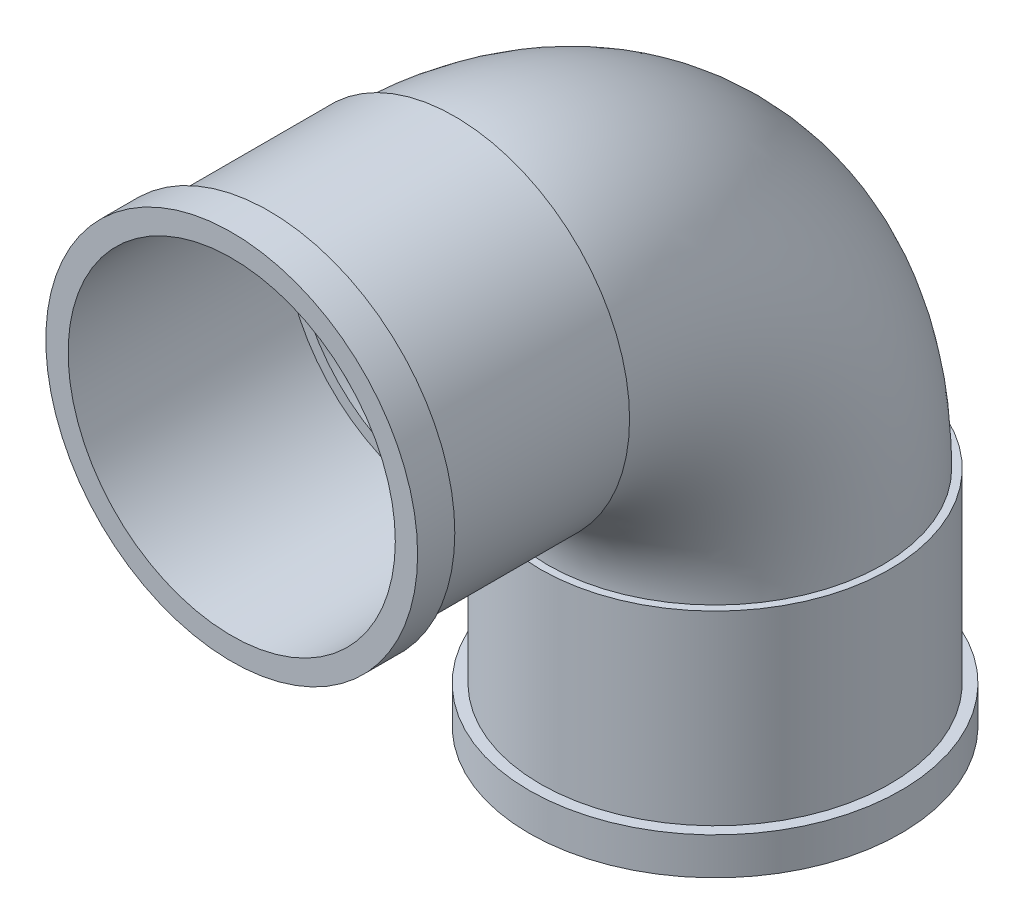
ISO-10303-21;
HEADER;
FILE_DESCRIPTION(('STEP AP214'),'2;1');
FILE_NAME('part.step','',(''),(''),'','','');
FILE_SCHEMA(('AUTOMOTIVE_DESIGN { 1 0 10303 214 1 1 1 1 }'));
ENDSEC;
DATA;
#1=APPLICATION_CONTEXT('core data for automotive mechanical design processes');
#2=APPLICATION_PROTOCOL_DEFINITION('international standard','automotive_design',2000,#1);
#3=PRODUCT_CONTEXT('',#1,'mechanical');
#4=PRODUCT('Part','Part','',(#3));
#5=PRODUCT_RELATED_PRODUCT_CATEGORY('part','',(#4));
#6=PRODUCT_DEFINITION_FORMATION('','',#4);
#7=PRODUCT_DEFINITION_CONTEXT('part definition',#1,'design');
#8=PRODUCT_DEFINITION('design','',#6,#7);
#9=PRODUCT_DEFINITION_SHAPE('','',#8);
#10=(LENGTH_UNIT() NAMED_UNIT(*) SI_UNIT(.MILLI.,.METRE.));
#11=(NAMED_UNIT(*) PLANE_ANGLE_UNIT() SI_UNIT($,.RADIAN.));
#12=(NAMED_UNIT(*) SI_UNIT($,.STERADIAN.) SOLID_ANGLE_UNIT());
#13=UNCERTAINTY_MEASURE_WITH_UNIT(LENGTH_MEASURE(1.E-05),#10,'distance_accuracy_value','');
#14=(GEOMETRIC_REPRESENTATION_CONTEXT(3) GLOBAL_UNCERTAINTY_ASSIGNED_CONTEXT((#13)) GLOBAL_UNIT_ASSIGNED_CONTEXT((#10,
#11,#12)) REPRESENTATION_CONTEXT('',''));
#15=CARTESIAN_POINT('',(0.,0.,0.));
#16=DIRECTION('',(0.,0.,1.));
#17=DIRECTION('',(1.,0.,0.));
#18=AXIS2_PLACEMENT_3D('',#15,#16,#17);
#19=CARTESIAN_POINT('',(0.,0.,-30.));
#20=DIRECTION('',(0.,0.,1.));
#21=DIRECTION('',(1.,0.,0.));
#22=AXIS2_PLACEMENT_3D('',#19,#20,#21);
#23=CYLINDRICAL_SURFACE('',#22,23.5);
#24=CARTESIAN_POINT('',(0.,0.,-30.));
#25=DIRECTION('',(0.,0.,1.));
#26=DIRECTION('',(1.,0.,0.));
#27=AXIS2_PLACEMENT_3D('',#24,#25,#26);
#28=CIRCLE('',#27,23.5);
#29=CARTESIAN_POINT('',(23.5,0.,-30.));
#30=VERTEX_POINT('',#29);
#31=EDGE_CURVE('E75',#30,#30,#28,.T.);
#32=ORIENTED_EDGE('',*,*,#31,.T.);
#33=EDGE_LOOP('',(#32));
#34=FACE_BOUND('',#33,.T.);
#35=CARTESIAN_POINT('',(0.,0.,-5.));
#36=DIRECTION('',(0.,0.,1.));
#37=DIRECTION('',(1.,0.,0.));
#38=AXIS2_PLACEMENT_3D('',#35,#36,#37);
#39=CIRCLE('',#38,23.5);
#40=CARTESIAN_POINT('',(23.5,0.,-5.));
#41=VERTEX_POINT('',#40);
#42=EDGE_CURVE('E104',#41,#41,#39,.T.);
#43=ORIENTED_EDGE('',*,*,#42,.F.);
#44=EDGE_LOOP('',(#43));
#45=FACE_BOUND('',#44,.T.);
#46=ADVANCED_FACE('F68',(#34,#45),#23,.T.);
#47=CARTESIAN_POINT('',(0.,0.,-30.));
#48=DIRECTION('',(0.,0.,1.));
#49=DIRECTION('',(1.,0.,0.));
#50=AXIS2_PLACEMENT_3D('',#47,#48,#49);
#51=CYLINDRICAL_SURFACE('',#50,20.5);
#52=CARTESIAN_POINT('',(0.,0.,-29.));
#53=DIRECTION('',(0.,0.,1.));
#54=DIRECTION('',(1.,0.,0.));
#55=AXIS2_PLACEMENT_3D('',#52,#53,#54);
#56=CIRCLE('',#55,20.5);
#57=CARTESIAN_POINT('',(20.5,0.,-29.));
#58=VERTEX_POINT('',#57);
#59=EDGE_CURVE('E85',#58,#58,#56,.T.);
#60=ORIENTED_EDGE('',*,*,#59,.T.);
#61=EDGE_LOOP('',(#60));
#62=FACE_BOUND('',#61,.T.);
#63=CARTESIAN_POINT('',(0.,0.,-30.));
#64=DIRECTION('',(0.,0.,1.));
#65=DIRECTION('',(0.,-1.,0.));
#66=AXIS2_PLACEMENT_3D('',#63,#64,#65);
#67=CIRCLE('',#66,20.5);
#68=CARTESIAN_POINT('',(0.,20.5,-30.));
#69=VERTEX_POINT('',#68);
#70=EDGE_CURVE('E100',#69,#69,#67,.T.);
#71=ORIENTED_EDGE('',*,*,#70,.F.);
#72=EDGE_LOOP('',(#71));
#73=FACE_BOUND('',#72,.T.);
#74=ADVANCED_FACE('F142',(#62,#73),#51,.F.);
#75=CARTESIAN_POINT('',(0.,0.,-30.));
#76=DIRECTION('',(0.,0.,1.));
#77=DIRECTION('',(1.,0.,0.));
#78=AXIS2_PLACEMENT_3D('',#75,#76,#77);
#79=PLANE('',#78);
#80=CARTESIAN_POINT('',(0.,0.,-30.));
#81=DIRECTION('',(0.,0.,1.));
#82=DIRECTION('',(1.,0.,0.));
#83=AXIS2_PLACEMENT_3D('',#80,#81,#82);
#84=CIRCLE('',#83,22.5);
#85=CARTESIAN_POINT('',(0.,22.5,-30.));
#86=VERTEX_POINT('',#85);
#87=EDGE_CURVE('E11',#86,#86,#84,.F.);
#88=ORIENTED_EDGE('',*,*,#87,.F.);
#89=EDGE_LOOP('',(#88));
#90=FACE_BOUND('',#89,.T.);
#91=ORIENTED_EDGE('',*,*,#31,.F.);
#92=EDGE_LOOP('',(#91));
#93=FACE_BOUND('',#92,.T.);
#94=ADVANCED_FACE('F147',(#90,#93),#79,.F.);
#95=CARTESIAN_POINT('',(0.,0.,0.));
#96=DIRECTION('',(0.,0.,1.));
#97=DIRECTION('',(1.,0.,0.));
#98=AXIS2_PLACEMENT_3D('',#95,#96,#97);
#99=PLANE('',#98);
#100=CARTESIAN_POINT('',(0.,0.,0.));
#101=DIRECTION('',(0.,0.,1.));
#102=DIRECTION('',(1.,0.,0.));
#103=AXIS2_PLACEMENT_3D('',#100,#101,#102);
#104=CIRCLE('',#103,22.);
#105=CARTESIAN_POINT('',(22.,0.,0.));
#106=VERTEX_POINT('',#105);
#107=EDGE_CURVE('E82',#106,#106,#104,.T.);
#108=ORIENTED_EDGE('',*,*,#107,.F.);
#109=EDGE_LOOP('',(#108));
#110=FACE_BOUND('',#109,.T.);
#111=CARTESIAN_POINT('',(0.,0.,0.));
#112=DIRECTION('',(0.,0.,1.));
#113=DIRECTION('',(1.,0.,0.));
#114=AXIS2_PLACEMENT_3D('',#111,#112,#113);
#115=CIRCLE('',#114,25.);
#116=CARTESIAN_POINT('',(25.,0.,0.));
#117=VERTEX_POINT('',#116);
#118=EDGE_CURVE('E114',#117,#117,#115,.T.);
#119=ORIENTED_EDGE('',*,*,#118,.T.);
#120=EDGE_LOOP('',(#119));
#121=FACE_BOUND('',#120,.T.);
#122=ADVANCED_FACE('F205',(#110,#121),#99,.T.);
#123=CARTESIAN_POINT('',(0.,0.,-29.));
#124=DIRECTION('',(0.,0.,1.));
#125=DIRECTION('',(1.,0.,0.));
#126=AXIS2_PLACEMENT_3D('',#123,#124,#125);
#127=CYLINDRICAL_SURFACE('',#126,22.);
#128=CARTESIAN_POINT('',(0.,0.,-29.));
#129=DIRECTION('',(0.,0.,1.));
#130=DIRECTION('',(1.,0.,0.));
#131=AXIS2_PLACEMENT_3D('',#128,#129,#130);
#132=CIRCLE('',#131,22.);
#133=CARTESIAN_POINT('',(22.,0.,-29.));
#134=VERTEX_POINT('',#133);
#135=EDGE_CURVE('E79',#134,#134,#132,.T.);
#136=CARTESIAN_POINT('',(22.,0.,-29.));
#137=CARTESIAN_POINT('',(22.,0.,-28.6979166666667));
#138=CARTESIAN_POINT('',(22.,0.,-28.3958333333333));
#139=CARTESIAN_POINT('',(22.,0.,-27.7916666666667));
#140=CARTESIAN_POINT('',(22.,0.,-27.4895833333333));
#141=CARTESIAN_POINT('',(22.,0.,-26.8854166666667));
#142=CARTESIAN_POINT('',(22.,0.,-26.5833333333333));
#143=CARTESIAN_POINT('',(22.,0.,-25.9791666666667));
#144=CARTESIAN_POINT('',(22.,0.,-25.6770833333333));
#145=CARTESIAN_POINT('',(22.,0.,-25.0729166666667));
#146=CARTESIAN_POINT('',(22.,0.,-24.7708333333333));
#147=CARTESIAN_POINT('',(22.,0.,-24.1666666666667));
#148=CARTESIAN_POINT('',(22.,0.,-23.8645833333333));
#149=CARTESIAN_POINT('',(22.,0.,-23.2604166666667));
#150=CARTESIAN_POINT('',(22.,0.,-22.9583333333333));
#151=CARTESIAN_POINT('',(22.,0.,-22.3541666666667));
#152=CARTESIAN_POINT('',(22.,0.,-22.0520833333333));
#153=CARTESIAN_POINT('',(22.,0.,-21.4479166666667));
#154=CARTESIAN_POINT('',(22.,0.,-21.1458333333333));
#155=CARTESIAN_POINT('',(22.,0.,-20.5416666666667));
#156=CARTESIAN_POINT('',(22.,0.,-20.2395833333333));
#157=CARTESIAN_POINT('',(22.,0.,-19.6354166666667));
#158=CARTESIAN_POINT('',(22.,0.,-19.3333333333333));
#159=CARTESIAN_POINT('',(22.,0.,-18.7291666666667));
#160=CARTESIAN_POINT('',(22.,0.,-18.4270833333333));
#161=CARTESIAN_POINT('',(22.,0.,-17.8229166666667));
#162=CARTESIAN_POINT('',(22.,0.,-17.5208333333333));
#163=CARTESIAN_POINT('',(22.,0.,-16.9166666666667));
#164=CARTESIAN_POINT('',(22.,0.,-16.6145833333333));
#165=CARTESIAN_POINT('',(22.,0.,-16.0104166666667));
#166=CARTESIAN_POINT('',(22.,0.,-15.7083333333333));
#167=CARTESIAN_POINT('',(22.,0.,-15.1041666666667));
#168=CARTESIAN_POINT('',(22.,0.,-14.8020833333333));
#169=CARTESIAN_POINT('',(22.,0.,-14.1979166666667));
#170=CARTESIAN_POINT('',(22.,0.,-13.8958333333333));
#171=CARTESIAN_POINT('',(22.,0.,-13.2916666666667));
#172=CARTESIAN_POINT('',(22.,0.,-12.9895833333333));
#173=CARTESIAN_POINT('',(22.,0.,-12.3854166666667));
#174=CARTESIAN_POINT('',(22.,0.,-12.0833333333333));
#175=CARTESIAN_POINT('',(22.,0.,-11.4791666666667));
#176=CARTESIAN_POINT('',(22.,0.,-11.1770833333333));
#177=CARTESIAN_POINT('',(22.,0.,-10.5729166666667));
#178=CARTESIAN_POINT('',(22.,0.,-10.2708333333333));
#179=CARTESIAN_POINT('',(22.,0.,-9.66666666666667));
#180=CARTESIAN_POINT('',(22.,0.,-9.36458333333333));
#181=CARTESIAN_POINT('',(22.,0.,-8.76041666666667));
#182=CARTESIAN_POINT('',(22.,0.,-8.45833333333334));
#183=CARTESIAN_POINT('',(22.,0.,-7.85416666666667));
#184=CARTESIAN_POINT('',(22.,0.,-7.55208333333334));
#185=CARTESIAN_POINT('',(22.,0.,-6.94791666666667));
#186=CARTESIAN_POINT('',(22.,0.,-6.64583333333334));
#187=CARTESIAN_POINT('',(22.,0.,-6.04166666666667));
#188=CARTESIAN_POINT('',(22.,0.,-5.73958333333333));
#189=CARTESIAN_POINT('',(22.,0.,-5.13541666666667));
#190=CARTESIAN_POINT('',(22.,0.,-4.83333333333333));
#191=CARTESIAN_POINT('',(22.,0.,-4.22916666666667));
#192=CARTESIAN_POINT('',(22.,0.,-3.92708333333333));
#193=CARTESIAN_POINT('',(22.,0.,-3.32291666666667));
#194=CARTESIAN_POINT('',(22.,0.,-3.02083333333333));
#195=CARTESIAN_POINT('',(22.,0.,-2.41666666666667));
#196=CARTESIAN_POINT('',(22.,0.,-2.11458333333334));
#197=CARTESIAN_POINT('',(22.,0.,-1.51041666666667));
#198=CARTESIAN_POINT('',(22.,0.,-1.20833333333333));
#199=CARTESIAN_POINT('',(22.,0.,-0.604166666666667));
#200=CARTESIAN_POINT('',(22.,0.,-0.302083333333333));
#201=CARTESIAN_POINT('',(22.,0.,0.));
#202=B_SPLINE_CURVE_WITH_KNOTS('',3,(#136,#137,#138,#139,#140,#141,#142,#143,#144,#145,#146,
#147,#148,#149,#150,#151,#152,#153,#154,#155,#156,#157,#158,#159,#160,#161,#162,#163,#164,#165,
#166,#167,#168,#169,#170,#171,#172,#173,#174,#175,#176,#177,#178,#179,#180,#181,#182,#183,#184,
#185,#186,#187,#188,#189,#190,#191,#192,#193,#194,#195,#196,#197,#198,#199,#200,#201),
.UNSPECIFIED.,.F.,.F.,(4,2,2,2,2,2,2,2,2,2,2,2,2,2,2,2,2,2,2,2,2,2,2,2,2,2,2,2,2,2,2,2,4),(0.,
0.906250000000001,1.8125,2.71875,3.625,4.53125,5.4375,6.34375,7.25,8.15625,9.0625,
9.96875000000001,10.875,11.78125,12.6875,13.59375,14.5,15.40625,16.3125,17.21875,18.125,
19.03125,19.9375,20.84375,21.75,22.65625,23.5625,24.46875,25.375,26.28125,27.1875,28.09375,29.),.UNSPECIFIED.);
#203=EDGE_CURVE('BSEAM201',#134,#106,#202,.T.);
#204=ORIENTED_EDGE('',*,*,#135,.F.);
#205=ORIENTED_EDGE('',*,*,#107,.T.);
#206=ORIENTED_EDGE('',*,*,#203,.T.);
#207=ORIENTED_EDGE('',*,*,#203,.F.);
#208=EDGE_LOOP('',(#204,#206,#205,#207));
#209=FACE_BOUND('',#208,.T.);
#210=ADVANCED_FACE('F201',(#209),#127,.F.);
#211=CARTESIAN_POINT('',(0.,0.,-29.));
#212=DIRECTION('',(0.,0.,1.));
#213=DIRECTION('',(1.,0.,0.));
#214=AXIS2_PLACEMENT_3D('',#211,#212,#213);
#215=PLANE('',#214);
#216=ORIENTED_EDGE('',*,*,#59,.F.);
#217=EDGE_LOOP('',(#216));
#218=FACE_BOUND('',#217,.T.);
#219=ORIENTED_EDGE('',*,*,#135,.T.);
#220=EDGE_LOOP('',(#219));
#221=FACE_BOUND('',#220,.T.);
#222=ADVANCED_FACE('F196',(#218,#221),#215,.T.);
#223=CARTESIAN_POINT('',(0.,-35.,-30.));
#224=DIRECTION('',(-1.,0.,0.));
#225=DIRECTION('',(0.,0.,1.));
#226=AXIS2_PLACEMENT_3D('',#223,#224,#225);
#227=TOROIDAL_SURFACE('',#226,35.,22.5);
#228=CARTESIAN_POINT('',(0.,-35.,-65.));
#229=DIRECTION('',(0.,1.,0.));
#230=DIRECTION('',(0.,0.,1.));
#231=AXIS2_PLACEMENT_3D('',#228,#229,#230);
#232=CIRCLE('',#231,22.5);
#233=CARTESIAN_POINT('',(0.,-35.,-87.5));
#234=VERTEX_POINT('',#233);
#235=EDGE_CURVE('E86',#234,#234,#232,.T.);
#236=CARTESIAN_POINT('',(0.,-35.,-30.));
#237=DIRECTION('',(-1.,0.,0.));
#238=DIRECTION('',(0.,0.,1.));
#239=AXIS2_PLACEMENT_3D('',#236,#237,#238);
#240=CIRCLE('',#239,57.5);
#241=EDGE_CURVE('',#86,#234,#240,.T.);
#242=ORIENTED_EDGE('',*,*,#87,.T.);
#243=ORIENTED_EDGE('',*,*,#235,.T.);
#244=ORIENTED_EDGE('',*,*,#241,.T.);
#245=ORIENTED_EDGE('',*,*,#241,.F.);
#246=EDGE_LOOP('',(#242,#244,#243,#245));
#247=FACE_BOUND('',#246,.T.);
#248=ADVANCED_FACE('F185',(#247),#227,.T.);
#249=CARTESIAN_POINT('',(0.,-36.,-65.));
#250=DIRECTION('',(0.,-1.,0.));
#251=DIRECTION('',(0.,0.,-1.));
#252=AXIS2_PLACEMENT_3D('',#249,#250,#251);
#253=CYLINDRICAL_SURFACE('',#252,22.);
#254=CARTESIAN_POINT('',(0.,-65.,-65.));
#255=DIRECTION('',(0.,1.,0.));
#256=DIRECTION('',(0.,0.,1.));
#257=AXIS2_PLACEMENT_3D('',#254,#255,#256);
#258=CIRCLE('',#257,22.);
#259=CARTESIAN_POINT('',(0.,-65.,-87.));
#260=VERTEX_POINT('',#259);
#261=EDGE_CURVE('E96',#260,#260,#258,.T.);
#262=CARTESIAN_POINT('',(0.,-36.3626942738953,-65.));
#263=DIRECTION('',(0.,1.,0.));
#264=DIRECTION('',(0.,0.,1.));
#265=AXIS2_PLACEMENT_3D('',#262,#263,#264);
#266=CIRCLE('',#265,22.);
#267=CARTESIAN_POINT('',(0.,-36.3626942738953,-87.));
#268=VERTEX_POINT('',#267);
#269=EDGE_CURVE('E71',#268,#268,#266,.F.);
#270=CARTESIAN_POINT('',(0.,-65.,-87.));
#271=CARTESIAN_POINT('',(0.,-64.7016947320198,-87.));
#272=CARTESIAN_POINT('',(0.,-64.4033894640395,-87.));
#273=CARTESIAN_POINT('',(0.,-63.806778928079,-87.));
#274=CARTESIAN_POINT('',(0.,-63.5084736600987,-87.));
#275=CARTESIAN_POINT('',(0.,-62.9118631241382,-87.));
#276=CARTESIAN_POINT('',(0.,-62.613557856158,-87.));
#277=CARTESIAN_POINT('',(0.,-62.0169473201974,-87.));
#278=CARTESIAN_POINT('',(0.,-61.7186420522172,-87.));
#279=CARTESIAN_POINT('',(0.,-61.1220315162567,-87.));
#280=CARTESIAN_POINT('',(0.,-60.8237262482764,-87.));
#281=CARTESIAN_POINT('',(0.,-60.2271157123159,-87.));
#282=CARTESIAN_POINT('',(0.,-59.9288104443356,-87.));
#283=CARTESIAN_POINT('',(0.,-59.3321999083751,-87.));
#284=CARTESIAN_POINT('',(0.,-59.0338946403949,-87.));
#285=CARTESIAN_POINT('',(0.,-58.4372841044344,-87.));
#286=CARTESIAN_POINT('',(0.,-58.1389788364541,-87.));
#287=CARTESIAN_POINT('',(0.,-57.5423683004936,-87.));
#288=CARTESIAN_POINT('',(0.,-57.2440630325133,-87.));
#289=CARTESIAN_POINT('',(0.,-56.6474524965528,-87.));
#290=CARTESIAN_POINT('',(0.,-56.3491472285726,-87.));
#291=CARTESIAN_POINT('',(0.,-55.752536692612,-87.));
#292=CARTESIAN_POINT('',(0.,-55.4542314246318,-87.));
#293=CARTESIAN_POINT('',(0.,-54.8576208886713,-87.));
#294=CARTESIAN_POINT('',(0.,-54.559315620691,-87.));
#295=CARTESIAN_POINT('',(0.,-53.9627050847305,-87.));
#296=CARTESIAN_POINT('',(0.,-53.6643998167502,-87.));
#297=CARTESIAN_POINT('',(0.,-53.0677892807897,-87.));
#298=CARTESIAN_POINT('',(0.,-52.7694840128095,-87.));
#299=CARTESIAN_POINT('',(0.,-52.1728734768489,-87.));
#300=CARTESIAN_POINT('',(0.,-51.8745682088687,-87.));
#301=CARTESIAN_POINT('',(0.,-51.2779576729082,-87.));
#302=CARTESIAN_POINT('',(0.,-50.9796524049279,-87.));
#303=CARTESIAN_POINT('',(0.,-50.3830418689674,-87.));
#304=CARTESIAN_POINT('',(0.,-50.0847366009872,-87.));
#305=CARTESIAN_POINT('',(0.,-49.4881260650266,-87.));
#306=CARTESIAN_POINT('',(0.,-49.1898207970464,-87.));
#307=CARTESIAN_POINT('',(0.,-48.5932102610859,-87.));
#308=CARTESIAN_POINT('',(0.,-48.2949049931056,-87.));
#309=CARTESIAN_POINT('',(0.,-47.6982944571451,-87.));
#310=CARTESIAN_POINT('',(0.,-47.3999891891648,-87.));
#311=CARTESIAN_POINT('',(0.,-46.8033786532043,-87.));
#312=CARTESIAN_POINT('',(0.,-46.5050733852241,-87.));
#313=CARTESIAN_POINT('',(0.,-45.9084628492636,-87.));
#314=CARTESIAN_POINT('',(0.,-45.6101575812833,-87.));
#315=CARTESIAN_POINT('',(0.,-45.0135470453228,-87.));
#316=CARTESIAN_POINT('',(0.,-44.7152417773425,-87.));
#317=CARTESIAN_POINT('',(0.,-44.118631241382,-87.));
#318=CARTESIAN_POINT('',(0.,-43.8203259734018,-87.));
#319=CARTESIAN_POINT('',(0.,-43.2237154374412,-87.));
#320=CARTESIAN_POINT('',(0.,-42.925410169461,-87.));
#321=CARTESIAN_POINT('',(0.,-42.3287996335005,-87.));
#322=CARTESIAN_POINT('',(0.,-42.0304943655202,-87.));
#323=CARTESIAN_POINT('',(0.,-41.4338838295597,-87.));
#324=CARTESIAN_POINT('',(0.,-41.1355785615794,-87.));
#325=CARTESIAN_POINT('',(0.,-40.5389680256189,-87.));
#326=CARTESIAN_POINT('',(0.,-40.2406627576387,-87.));
#327=CARTESIAN_POINT('',(0.,-39.6440522216782,-87.));
#328=CARTESIAN_POINT('',(0.,-39.3457469536979,-87.));
#329=CARTESIAN_POINT('',(0.,-38.7491364177374,-87.));
#330=CARTESIAN_POINT('',(0.,-38.4508311497571,-87.));
#331=CARTESIAN_POINT('',(0.,-37.8542206137966,-87.));
#332=CARTESIAN_POINT('',(0.,-37.5559153458164,-87.));
#333=CARTESIAN_POINT('',(0.,-36.9593048098558,-87.));
#334=CARTESIAN_POINT('',(0.,-36.6609995418756,-87.));
#335=CARTESIAN_POINT('',(0.,-36.3626942738953,-87.));
#336=B_SPLINE_CURVE_WITH_KNOTS('',3,(#270,#271,#272,#273,#274,#275,#276,#277,#278,#279,#280,
#281,#282,#283,#284,#285,#286,#287,#288,#289,#290,#291,#292,#293,#294,#295,#296,#297,#298,#299,
#300,#301,#302,#303,#304,#305,#306,#307,#308,#309,#310,#311,#312,#313,#314,#315,#316,#317,#318,
#319,#320,#321,#322,#323,#324,#325,#326,#327,#328,#329,#330,#331,#332,#333,#334,#335),
.UNSPECIFIED.,.F.,.F.,(4,2,2,2,2,2,2,2,2,2,2,2,2,2,2,2,2,2,2,2,2,2,2,2,2,2,2,2,2,2,2,2,4),(0.,
0.894915803940771,1.78983160788154,2.68474741182231,3.57966321576308,4.47457901970386,
5.36949482364463,6.26441062758541,7.15932643152618,8.05424223546695,8.94915803940772,
9.84407384334849,10.7389896472893,11.63390545123,12.5288212551708,13.4237370591116,
14.3186528630523,15.2135686669931,16.1084844709339,17.0034002748747,17.8983160788154,
18.7932318827562,19.688147686697,20.5830634906377,21.4779792945785,22.3728950985193,
23.2678109024601,24.1627267064008,25.0576425103416,25.9525583142824,26.8474741182232,
27.7423899221639,28.6373057261047),.UNSPECIFIED.);
#337=EDGE_CURVE('BSEAM181',#260,#268,#336,.T.);
#338=ORIENTED_EDGE('',*,*,#261,.F.);
#339=ORIENTED_EDGE('',*,*,#269,.F.);
#340=ORIENTED_EDGE('',*,*,#337,.T.);
#341=ORIENTED_EDGE('',*,*,#337,.F.);
#342=EDGE_LOOP('',(#338,#340,#339,#341));
#343=FACE_BOUND('',#342,.T.);
#344=ADVANCED_FACE('F181',(#343),#253,.F.);
#345=CARTESIAN_POINT('',(0.,-65.,0.));
#346=DIRECTION('',(0.,1.,0.));
#347=DIRECTION('',(0.,0.,1.));
#348=AXIS2_PLACEMENT_3D('',#345,#346,#347);
#349=PLANE('',#348);
#350=ORIENTED_EDGE('',*,*,#261,.T.);
#351=EDGE_LOOP('',(#350));
#352=FACE_BOUND('',#351,.T.);
#353=CARTESIAN_POINT('',(0.,-65.,-65.));
#354=DIRECTION('',(0.,1.,0.));
#355=DIRECTION('',(0.,0.,1.));
#356=AXIS2_PLACEMENT_3D('',#353,#354,#355);
#357=CIRCLE('',#356,25.);
#358=CARTESIAN_POINT('',(0.,-65.,-40.));
#359=VERTEX_POINT('',#358);
#360=EDGE_CURVE('E117',#359,#359,#357,.T.);
#361=ORIENTED_EDGE('',*,*,#360,.F.);
#362=EDGE_LOOP('',(#361));
#363=FACE_BOUND('',#362,.T.);
#364=ADVANCED_FACE('F184',(#352,#363),#349,.F.);
#365=CARTESIAN_POINT('',(0.,-35.,-65.));
#366=DIRECTION('',(0.,-1.,0.));
#367=DIRECTION('',(0.,0.,-1.));
#368=AXIS2_PLACEMENT_3D('',#365,#366,#367);
#369=CYLINDRICAL_SURFACE('',#368,23.5);
#370=CARTESIAN_POINT('',(0.,-60.,-65.));
#371=DIRECTION('',(0.,1.,0.));
#372=DIRECTION('',(0.,0.,1.));
#373=AXIS2_PLACEMENT_3D('',#370,#371,#372);
#374=CIRCLE('',#373,23.5);
#375=CARTESIAN_POINT('',(0.,-60.,-41.5));
#376=VERTEX_POINT('',#375);
#377=EDGE_CURVE('E123',#376,#376,#374,.T.);
#378=ORIENTED_EDGE('',*,*,#377,.T.);
#379=EDGE_LOOP('',(#378));
#380=FACE_BOUND('',#379,.T.);
#381=CARTESIAN_POINT('',(0.,-35.,-65.));
#382=DIRECTION('',(0.,1.,0.));
#383=DIRECTION('',(0.,0.,1.));
#384=AXIS2_PLACEMENT_3D('',#381,#382,#383);
#385=CIRCLE('',#384,23.5);
#386=CARTESIAN_POINT('',(0.,-35.,-41.5));
#387=VERTEX_POINT('',#386);
#388=EDGE_CURVE('E93',#387,#387,#385,.T.);
#389=ORIENTED_EDGE('',*,*,#388,.F.);
#390=EDGE_LOOP('',(#389));
#391=FACE_BOUND('',#390,.T.);
#392=ADVANCED_FACE('F127',(#380,#391),#369,.T.);
#393=CARTESIAN_POINT('',(0.,-35.,0.));
#394=DIRECTION('',(0.,1.,0.));
#395=DIRECTION('',(0.,0.,1.));
#396=AXIS2_PLACEMENT_3D('',#393,#394,#395);
#397=PLANE('',#396);
#398=ORIENTED_EDGE('',*,*,#235,.F.);
#399=EDGE_LOOP('',(#398));
#400=FACE_BOUND('',#399,.T.);
#401=ORIENTED_EDGE('',*,*,#388,.T.);
#402=EDGE_LOOP('',(#401));
#403=FACE_BOUND('',#402,.T.);
#404=ADVANCED_FACE('F175',(#400,#403),#397,.T.);
#405=CARTESIAN_POINT('',(0.,-36.3626942738953,-65.));
#406=DIRECTION('',(0.,1.,0.));
#407=DIRECTION('',(0.,0.,1.));
#408=AXIS2_PLACEMENT_3D('',#405,#406,#407);
#409=PLANE('',#408);
#410=CARTESIAN_POINT('',(0.,-36.3626942738953,-64.9999999999989));
#411=DIRECTION('',(0.,1.,0.));
#412=DIRECTION('',(0.,0.,1.));
#413=AXIS2_PLACEMENT_3D('',#410,#411,#412);
#414=CIRCLE('',#413,20.5);
#415=CARTESIAN_POINT('',(0.,-36.3626942738953,-44.4999999999989));
#416=VERTEX_POINT('',#415);
#417=EDGE_CURVE('E99',#416,#416,#414,.T.);
#418=ORIENTED_EDGE('',*,*,#417,.T.);
#419=EDGE_LOOP('',(#418));
#420=FACE_BOUND('',#419,.T.);
#421=ORIENTED_EDGE('',*,*,#269,.T.);
#422=EDGE_LOOP('',(#421));
#423=FACE_BOUND('',#422,.T.);
#424=ADVANCED_FACE('F167',(#420,#423),#409,.F.);
#425=CARTESIAN_POINT('',(0.,-35.,-30.));
#426=DIRECTION('',(-1.,0.,0.));
#427=DIRECTION('',(0.,0.,1.));
#428=AXIS2_PLACEMENT_3D('',#425,#426,#427);
#429=TOROIDAL_SURFACE('',#428,35.,20.5);
#430=CARTESIAN_POINT('',(0.,-35.000000000002,-64.9999999999989));
#431=DIRECTION('',(0.,1.,0.));
#432=DIRECTION('',(0.,0.,1.));
#433=AXIS2_PLACEMENT_3D('',#430,#431,#432);
#434=CIRCLE('',#433,20.5);
#435=CARTESIAN_POINT('',(0.,-35.0000000000032,-85.5));
#436=VERTEX_POINT('',#435);
#437=EDGE_CURVE('E103',#436,#436,#434,.T.);
#438=CARTESIAN_POINT('',(0.,-35.,-30.));
#439=DIRECTION('',(-1.,0.,0.));
#440=DIRECTION('',(0.,0.,1.));
#441=AXIS2_PLACEMENT_3D('',#438,#439,#440);
#442=CIRCLE('',#441,55.5);
#443=EDGE_CURVE('',#69,#436,#442,.T.);
#444=ORIENTED_EDGE('',*,*,#70,.T.);
#445=ORIENTED_EDGE('',*,*,#437,.F.);
#446=ORIENTED_EDGE('',*,*,#443,.T.);
#447=ORIENTED_EDGE('',*,*,#443,.F.);
#448=EDGE_LOOP('',(#444,#446,#445,#447));
#449=FACE_BOUND('',#448,.T.);
#450=ADVANCED_FACE('F158',(#449),#429,.F.);
#451=CARTESIAN_POINT('',(0.,-35.000000000002,-64.9999999999989));
#452=DIRECTION('',(0.,-1.,0.));
#453=DIRECTION('',(0.,0.,-1.));
#454=AXIS2_PLACEMENT_3D('',#451,#452,#453);
#455=CYLINDRICAL_SURFACE('',#454,20.5);
#456=ORIENTED_EDGE('',*,*,#417,.F.);
#457=EDGE_LOOP('',(#456));
#458=FACE_BOUND('',#457,.T.);
#459=ORIENTED_EDGE('',*,*,#437,.T.);
#460=EDGE_LOOP('',(#459));
#461=FACE_BOUND('',#460,.T.);
#462=ADVANCED_FACE('F155',(#458,#461),#455,.F.);
#463=CARTESIAN_POINT('',(0.,0.,-5.));
#464=DIRECTION('',(0.,0.,1.));
#465=DIRECTION('',(1.,0.,0.));
#466=AXIS2_PLACEMENT_3D('',#463,#464,#465);
#467=PLANE('',#466);
#468=CARTESIAN_POINT('',(0.,0.,-5.));
#469=DIRECTION('',(0.,0.,1.));
#470=DIRECTION('',(1.,0.,0.));
#471=AXIS2_PLACEMENT_3D('',#468,#469,#470);
#472=CIRCLE('',#471,25.);
#473=CARTESIAN_POINT('',(25.,0.,-5.));
#474=VERTEX_POINT('',#473);
#475=EDGE_CURVE('E111',#474,#474,#472,.T.);
#476=ORIENTED_EDGE('',*,*,#475,.F.);
#477=EDGE_LOOP('',(#476));
#478=FACE_BOUND('',#477,.T.);
#479=ORIENTED_EDGE('',*,*,#42,.T.);
#480=EDGE_LOOP('',(#479));
#481=FACE_BOUND('',#480,.T.);
#482=ADVANCED_FACE('F153',(#478,#481),#467,.F.);
#483=CARTESIAN_POINT('',(0.,0.,0.));
#484=DIRECTION('',(0.,0.,1.));
#485=DIRECTION('',(1.,0.,0.));
#486=AXIS2_PLACEMENT_3D('',#483,#484,#485);
#487=CYLINDRICAL_SURFACE('',#486,25.);
#488=ORIENTED_EDGE('',*,*,#475,.T.);
#489=EDGE_LOOP('',(#488));
#490=FACE_BOUND('',#489,.T.);
#491=ORIENTED_EDGE('',*,*,#118,.F.);
#492=EDGE_LOOP('',(#491));
#493=FACE_BOUND('',#492,.T.);
#494=ADVANCED_FACE('F138',(#490,#493),#487,.T.);
#495=CARTESIAN_POINT('',(0.,0.,-65.));
#496=DIRECTION('',(0.,1.,0.));
#497=DIRECTION('',(0.,0.,1.));
#498=AXIS2_PLACEMENT_3D('',#495,#496,#497);
#499=CYLINDRICAL_SURFACE('',#498,25.);
#500=CARTESIAN_POINT('',(0.,-60.,-65.));
#501=DIRECTION('',(0.,1.,0.));
#502=DIRECTION('',(0.,0.,1.));
#503=AXIS2_PLACEMENT_3D('',#500,#501,#502);
#504=CIRCLE('',#503,25.);
#505=CARTESIAN_POINT('',(0.,-60.,-40.));
#506=VERTEX_POINT('',#505);
#507=EDGE_CURVE('E120',#506,#506,#504,.T.);
#508=ORIENTED_EDGE('',*,*,#507,.F.);
#509=EDGE_LOOP('',(#508));
#510=FACE_BOUND('',#509,.T.);
#511=ORIENTED_EDGE('',*,*,#360,.T.);
#512=EDGE_LOOP('',(#511));
#513=FACE_BOUND('',#512,.T.);
#514=ADVANCED_FACE('F132',(#510,#513),#499,.T.);
#515=CARTESIAN_POINT('',(0.,-60.,0.));
#516=DIRECTION('',(0.,1.,0.));
#517=DIRECTION('',(0.,0.,1.));
#518=AXIS2_PLACEMENT_3D('',#515,#516,#517);
#519=PLANE('',#518);
#520=ORIENTED_EDGE('',*,*,#507,.T.);
#521=EDGE_LOOP('',(#520));
#522=FACE_BOUND('',#521,.T.);
#523=ORIENTED_EDGE('',*,*,#377,.F.);
#524=EDGE_LOOP('',(#523));
#525=FACE_BOUND('',#524,.T.);
#526=ADVANCED_FACE('F130',(#522,#525),#519,.T.);
#527=CLOSED_SHELL('',(#46,#74,#94,#122,#210,#222,#248,#344,#364,#392,#404,#424,#450,#462,#482,
#494,#514,#526));
#528=MANIFOLD_SOLID_BREP('B2',#527);
#529=ADVANCED_BREP_SHAPE_REPRESENTATION('',(#18,#528),#14);
#530=SHAPE_DEFINITION_REPRESENTATION(#9,#529);
ENDSEC;
END-ISO-10303-21;
